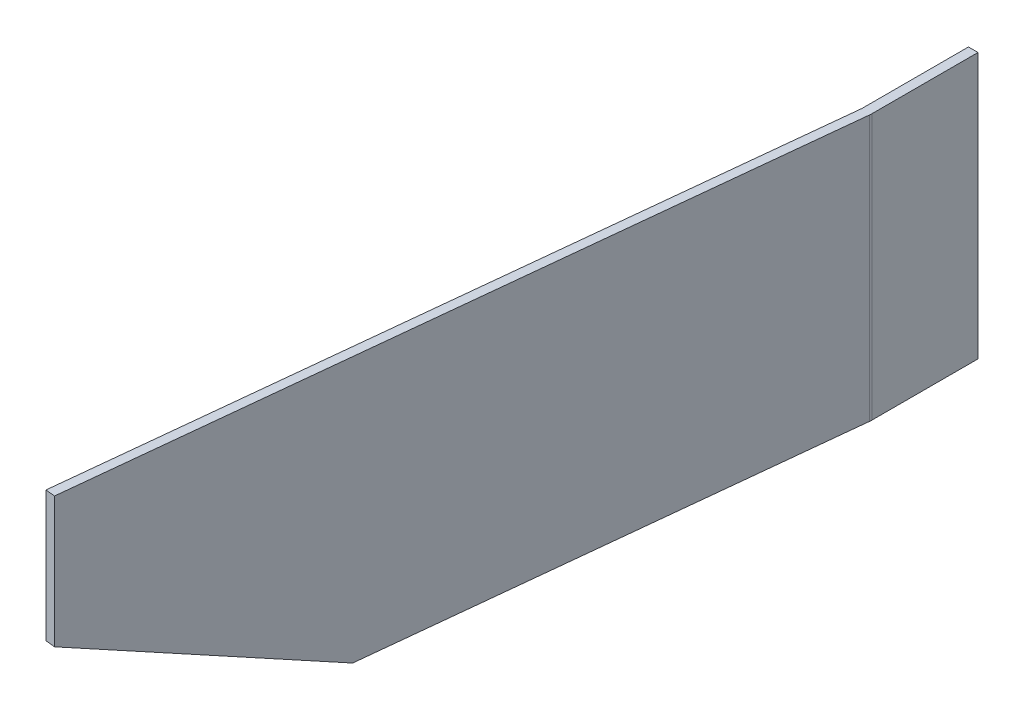
ISO-10303-21;
HEADER;
FILE_DESCRIPTION(('STEP AP214'),'2;1');
FILE_NAME('part.step','',(''),(''),'','','');
FILE_SCHEMA(('AUTOMOTIVE_DESIGN { 1 0 10303 214 1 1 1 1 }'));
ENDSEC;
DATA;
#1=APPLICATION_CONTEXT('core data for automotive mechanical design processes');
#2=APPLICATION_PROTOCOL_DEFINITION('international standard','automotive_design',2000,#1);
#3=PRODUCT_CONTEXT('',#1,'mechanical');
#4=PRODUCT('Part','Part','',(#3));
#5=PRODUCT_RELATED_PRODUCT_CATEGORY('part','',(#4));
#6=PRODUCT_DEFINITION_FORMATION('','',#4);
#7=PRODUCT_DEFINITION_CONTEXT('part definition',#1,'design');
#8=PRODUCT_DEFINITION('design','',#6,#7);
#9=PRODUCT_DEFINITION_SHAPE('','',#8);
#10=(LENGTH_UNIT() NAMED_UNIT(*) SI_UNIT(.MILLI.,.METRE.));
#11=(NAMED_UNIT(*) PLANE_ANGLE_UNIT() SI_UNIT($,.RADIAN.));
#12=(NAMED_UNIT(*) SI_UNIT($,.STERADIAN.) SOLID_ANGLE_UNIT());
#13=UNCERTAINTY_MEASURE_WITH_UNIT(LENGTH_MEASURE(1.E-05),#10,'distance_accuracy_value','');
#14=(GEOMETRIC_REPRESENTATION_CONTEXT(3) GLOBAL_UNCERTAINTY_ASSIGNED_CONTEXT((#13)) GLOBAL_UNIT_ASSIGNED_CONTEXT((#10,
#11,#12)) REPRESENTATION_CONTEXT('',''));
#15=CARTESIAN_POINT('',(0.,0.,0.));
#16=DIRECTION('',(0.,0.,1.));
#17=DIRECTION('',(1.,0.,0.));
#18=AXIS2_PLACEMENT_3D('',#15,#16,#17);
#19=CARTESIAN_POINT('',(-1.143,0.,0.));
#20=DIRECTION('',(-1.,0.,0.));
#21=DIRECTION('',(0.,0.,1.));
#22=AXIS2_PLACEMENT_3D('',#19,#20,#21);
#23=PLANE('',#22);
#24=DIRECTION('',(0.,0.,1.));
#25=VECTOR('',#24,1.);
#26=CARTESIAN_POINT('',(-1.143,-31.75,-32.4539806661532));
#27=LINE('',#26,#25);
#28=CARTESIAN_POINT('',(-1.143,-31.75,-101.6));
#29=VERTEX_POINT('',#28);
#30=CARTESIAN_POINT('',(-1.143,-31.75,-76.2));
#31=VERTEX_POINT('',#30);
#32=EDGE_CURVE('E98',#29,#31,#27,.T.);
#33=ORIENTED_EDGE('',*,*,#32,.T.);
#34=DIRECTION('',(0.,-1.,0.));
#35=VECTOR('',#34,1.);
#36=CARTESIAN_POINT('',(-1.143,-36.03433741048,-76.2));
#37=LINE('',#36,#35);
#38=CARTESIAN_POINT('',(-1.143,31.75,-76.2));
#39=VERTEX_POINT('',#38);
#40=EDGE_CURVE('E85',#31,#39,#37,.F.);
#41=ORIENTED_EDGE('',*,*,#40,.T.);
#42=DIRECTION('',(0.,0.,-1.));
#43=VECTOR('',#42,1.);
#44=CARTESIAN_POINT('',(-1.143,31.75,0.));
#45=LINE('',#44,#43);
#46=CARTESIAN_POINT('',(-1.143,31.75,-101.6));
#47=VERTEX_POINT('',#46);
#48=EDGE_CURVE('E102',#39,#47,#45,.T.);
#49=ORIENTED_EDGE('',*,*,#48,.T.);
#50=DIRECTION('',(0.,1.,0.));
#51=VECTOR('',#50,1.);
#52=CARTESIAN_POINT('',(-1.143,0.,-101.6));
#53=LINE('',#52,#51);
#54=EDGE_CURVE('E99',#47,#29,#53,.F.);
#55=ORIENTED_EDGE('',*,*,#54,.T.);
#56=EDGE_LOOP('',(#33,#41,#49,#55));
#57=FACE_BOUND('',#56,.T.);
#58=ADVANCED_FACE('F16',(#57),#23,.T.);
#59=CARTESIAN_POINT('',(0.,0.,-101.6));
#60=DIRECTION('',(0.,0.,1.));
#61=DIRECTION('',(1.,0.,0.));
#62=AXIS2_PLACEMENT_3D('',#59,#60,#61);
#63=PLANE('',#62);
#64=ORIENTED_EDGE('',*,*,#54,.F.);
#65=DIRECTION('',(1.,0.,0.));
#66=VECTOR('',#65,1.);
#67=CARTESIAN_POINT('',(0.,31.75,-101.6));
#68=LINE('',#67,#66);
#69=CARTESIAN_POINT('',(1.143,31.75,-101.6));
#70=VERTEX_POINT('',#69);
#71=EDGE_CURVE('E95',#47,#70,#68,.T.);
#72=ORIENTED_EDGE('',*,*,#71,.T.);
#73=DIRECTION('',(0.,1.,0.));
#74=VECTOR('',#73,1.);
#75=CARTESIAN_POINT('',(1.143,0.,-101.6));
#76=LINE('',#75,#74);
#77=CARTESIAN_POINT('',(1.143,-31.75,-101.6));
#78=VERTEX_POINT('',#77);
#79=EDGE_CURVE('E112',#70,#78,#76,.F.);
#80=ORIENTED_EDGE('',*,*,#79,.T.);
#81=DIRECTION('',(1.,0.,0.));
#82=VECTOR('',#81,1.);
#83=CARTESIAN_POINT('',(0.,-31.75,-101.6));
#84=LINE('',#83,#82);
#85=EDGE_CURVE('E103',#78,#29,#84,.F.);
#86=ORIENTED_EDGE('',*,*,#85,.T.);
#87=EDGE_LOOP('',(#64,#72,#80,#86));
#88=FACE_BOUND('',#87,.T.);
#89=ADVANCED_FACE('F272',(#88),#63,.F.);
#90=CARTESIAN_POINT('',(-3.429,-36.03433741048,-76.2));
#91=DIRECTION('',(0.,-1.,0.));
#92=DIRECTION('',(0.,0.,-1.));
#93=AXIS2_PLACEMENT_3D('',#90,#91,#92);
#94=CYLINDRICAL_SURFACE('',#93,2.286);
#95=ORIENTED_EDGE('',*,*,#40,.F.);
#96=CARTESIAN_POINT('',(-3.429,-31.75,-76.2));
#97=DIRECTION('',(0.,-1.,0.));
#98=DIRECTION('',(0.,0.,-1.));
#99=AXIS2_PLACEMENT_3D('',#96,#97,#98);
#100=CIRCLE('',#99,2.286);
#101=CARTESIAN_POINT('',(-1.15552294718611,-31.75,-75.9610479329711));
#102=VERTEX_POINT('',#101);
#103=EDGE_CURVE('E19',#31,#102,#100,.T.);
#104=ORIENTED_EDGE('',*,*,#103,.T.);
#105=DIRECTION('',(0.,1.,0.));
#106=VECTOR('',#105,1.);
#107=CARTESIAN_POINT('',(-1.15552294718375,0.,-75.9610479329719));
#108=LINE('',#107,#106);
#109=CARTESIAN_POINT('',(-1.15552294718611,31.75,-75.9610479329711));
#110=VERTEX_POINT('',#109);
#111=EDGE_CURVE('E110',#110,#102,#108,.F.);
#112=ORIENTED_EDGE('',*,*,#111,.F.);
#113=CARTESIAN_POINT('',(-3.429,31.75,-76.2));
#114=DIRECTION('',(0.,-1.,0.));
#115=DIRECTION('',(0.,0.,-1.));
#116=AXIS2_PLACEMENT_3D('',#113,#114,#115);
#117=CIRCLE('',#116,2.286);
#118=EDGE_CURVE('E91',#110,#39,#117,.F.);
#119=ORIENTED_EDGE('',*,*,#118,.T.);
#120=EDGE_LOOP('',(#95,#104,#112,#119));
#121=FACE_BOUND('',#120,.T.);
#122=ADVANCED_FACE('F87',(#121),#94,.F.);
#123=CARTESIAN_POINT('',(1.143,0.,0.));
#124=DIRECTION('',(-1.,0.,0.));
#125=DIRECTION('',(0.,0.,1.));
#126=AXIS2_PLACEMENT_3D('',#123,#124,#125);
#127=PLANE('',#126);
#128=ORIENTED_EDGE('',*,*,#79,.F.);
#129=DIRECTION('',(0.,0.,1.));
#130=VECTOR('',#129,1.);
#131=CARTESIAN_POINT('',(1.143,31.75,0.));
#132=LINE('',#131,#130);
#133=CARTESIAN_POINT('',(1.143,31.75,-76.2));
#134=VERTEX_POINT('',#133);
#135=EDGE_CURVE('E94',#134,#70,#132,.F.);
#136=ORIENTED_EDGE('',*,*,#135,.F.);
#137=DIRECTION('',(0.,-1.,0.));
#138=VECTOR('',#137,1.);
#139=CARTESIAN_POINT('',(1.143,-36.03433741048,-76.2));
#140=LINE('',#139,#138);
#141=CARTESIAN_POINT('',(1.143,-31.75,-76.2));
#142=VERTEX_POINT('',#141);
#143=EDGE_CURVE('E142',#142,#134,#140,.F.);
#144=ORIENTED_EDGE('',*,*,#143,.F.);
#145=DIRECTION('',(0.,0.,1.));
#146=VECTOR('',#145,1.);
#147=CARTESIAN_POINT('',(1.143,-31.75,0.));
#148=LINE('',#147,#146);
#149=EDGE_CURVE('E109',#78,#142,#148,.T.);
#150=ORIENTED_EDGE('',*,*,#149,.F.);
#151=EDGE_LOOP('',(#128,#136,#144,#150));
#152=FACE_BOUND('',#151,.T.);
#153=ADVANCED_FACE('F170',(#152),#127,.F.);
#154=CARTESIAN_POINT('',(-9.08760377733674,0.,-0.492340034575518));
#155=DIRECTION('',(-0.994521895368269,0.,-0.104528463267697));
#156=DIRECTION('',(-0.104528463267697,0.,0.994521895368269));
#157=AXIS2_PLACEMENT_3D('',#154,#155,#156);
#158=PLANE('',#157);
#159=DIRECTION('',(0.104528463267644,0.,-0.994521895368275));
#160=VECTOR('',#159,1.);
#161=CARTESIAN_POINT('',(-19.70769564533,31.75,100.551084534843));
#162=LINE('',#161,#160);
#163=CARTESIAN_POINT('',(-19.7076956453312,31.75,100.551084534842));
#164=VERTEX_POINT('',#163);
#165=EDGE_CURVE('E156',#164,#110,#162,.T.);
#166=ORIENTED_EDGE('',*,*,#165,.T.);
#167=ORIENTED_EDGE('',*,*,#111,.T.);
#168=DIRECTION('',(-0.10452846326765,0.,0.994521895368274));
#169=VECTOR('',#168,1.);
#170=CARTESIAN_POINT('',(-1.15552294718824,-31.75,-75.9610479329724));
#171=LINE('',#170,#169);
#172=CARTESIAN_POINT('',(-12.9229661934296,-31.7500000000005,35.9986958061476));
#173=VERTEX_POINT('',#172);
#174=EDGE_CURVE('E108',#102,#173,#171,.T.);
#175=ORIENTED_EDGE('',*,*,#174,.T.);
#176=DIRECTION('',(0.0936144907977763,-0.444883376374204,-0.890682383646697));
#177=VECTOR('',#176,1.);
#178=CARTESIAN_POINT('',(-19.7076956453299,0.493014095618827,100.551084534842));
#179=LINE('',#178,#177);
#180=CARTESIAN_POINT('',(-19.7076956453312,0.493014095618307,100.551084534842));
#181=VERTEX_POINT('',#180);
#182=EDGE_CURVE('E154',#181,#173,#179,.T.);
#183=ORIENTED_EDGE('',*,*,#182,.F.);
#184=DIRECTION('',(0.,1.,0.));
#185=VECTOR('',#184,1.);
#186=CARTESIAN_POINT('',(-19.7076956453299,16.1215070478079,100.551084534842));
#187=LINE('',#186,#185);
#188=EDGE_CURVE('E184',#181,#164,#187,.T.);
#189=ORIENTED_EDGE('',*,*,#188,.T.);
#190=EDGE_LOOP('',(#166,#167,#175,#183,#189));
#191=FACE_BOUND('',#190,.T.);
#192=ADVANCED_FACE('F194',(#191),#158,.T.);
#193=CARTESIAN_POINT('',(-3.429,-36.03433741048,-76.2));
#194=DIRECTION('',(0.,-1.,0.));
#195=DIRECTION('',(0.,0.,-1.));
#196=AXIS2_PLACEMENT_3D('',#193,#194,#195);
#197=CYLINDRICAL_SURFACE('',#196,4.572);
#198=CARTESIAN_POINT('',(-3.429,31.75,-76.2));
#199=DIRECTION('',(0.,-1.,0.));
#200=DIRECTION('',(0.,0.,-1.));
#201=AXIS2_PLACEMENT_3D('',#198,#199,#200);
#202=CIRCLE('',#201,4.572);
#203=CARTESIAN_POINT('',(1.11795410562549,31.75,-75.7220958659423));
#204=VERTEX_POINT('',#203);
#205=EDGE_CURVE('E140',#134,#204,#202,.T.);
#206=ORIENTED_EDGE('',*,*,#205,.T.);
#207=DIRECTION('',(0.,1.,0.));
#208=VECTOR('',#207,1.);
#209=CARTESIAN_POINT('',(1.11795410562725,0.,-75.7220958659444));
#210=LINE('',#209,#208);
#211=CARTESIAN_POINT('',(1.11795410562549,-31.75,-75.7220958659423));
#212=VERTEX_POINT('',#211);
#213=EDGE_CURVE('E158',#204,#212,#210,.F.);
#214=ORIENTED_EDGE('',*,*,#213,.T.);
#215=CARTESIAN_POINT('',(-3.429,-31.75,-76.2));
#216=DIRECTION('',(0.,-1.,0.));
#217=DIRECTION('',(0.,0.,-1.));
#218=AXIS2_PLACEMENT_3D('',#215,#216,#217);
#219=CIRCLE('',#218,4.572);
#220=EDGE_CURVE('E143',#212,#142,#219,.F.);
#221=ORIENTED_EDGE('',*,*,#220,.T.);
#222=ORIENTED_EDGE('',*,*,#143,.T.);
#223=EDGE_LOOP('',(#206,#214,#221,#222));
#224=FACE_BOUND('',#223,.T.);
#225=ADVANCED_FACE('F171',(#224),#197,.T.);
#226=CARTESIAN_POINT('',(-4.5585005249797,-31.75,-32.6490583654052));
#227=DIRECTION('',(0.,1.,0.));
#228=DIRECTION('',(0.,0.,1.));
#229=AXIS2_PLACEMENT_3D('',#226,#227,#228);
#230=PLANE('',#229);
#231=DIRECTION('',(0.994521895368351,-3.7031717247471E-13,0.104528463266911));
#232=VECTOR('',#231,1.);
#233=CARTESIAN_POINT('',(-12.9229661934293,-31.7500000000019,35.9986958061483));
#234=LINE('',#233,#232);
#235=CARTESIAN_POINT('',(-10.6494891406186,-31.7500000000007,36.2376478731753));
#236=VERTEX_POINT('',#235);
#237=EDGE_CURVE('E180',#173,#236,#234,.T.);
#238=ORIENTED_EDGE('',*,*,#237,.F.);
#239=ORIENTED_EDGE('',*,*,#174,.F.);
#240=ORIENTED_EDGE('',*,*,#103,.F.);
#241=ORIENTED_EDGE('',*,*,#32,.F.);
#242=ORIENTED_EDGE('',*,*,#85,.F.);
#243=ORIENTED_EDGE('',*,*,#149,.T.);
#244=ORIENTED_EDGE('',*,*,#220,.F.);
#245=DIRECTION('',(-0.104528463267697,0.,0.994521895368269));
#246=VECTOR('',#245,1.);
#247=CARTESIAN_POINT('',(-6.814126724526,-31.75,-0.253387967545556));
#248=LINE('',#247,#246);
#249=EDGE_CURVE('E159',#212,#236,#248,.T.);
#250=ORIENTED_EDGE('',*,*,#249,.T.);
#251=EDGE_LOOP('',(#238,#239,#240,#241,#242,#243,#244,#250));
#252=FACE_BOUND('',#251,.T.);
#253=ADVANCED_FACE('F106',(#252),#230,.F.);
#254=CARTESIAN_POINT('',(-15.1785923929755,-15.6284929521921,68.394366204009));
#255=DIRECTION('',(-0.0465029756657211,-0.89558851121812,0.44244625868951));
#256=DIRECTION('',(0.,-0.442925436940545,-0.896558451697951));
#257=AXIS2_PLACEMENT_3D('',#254,#255,#256);
#258=PLANE('',#257);
#259=ORIENTED_EDGE('',*,*,#237,.T.);
#260=DIRECTION('',(-0.0936144907978366,0.444883376374163,0.890682383646711));
#261=VECTOR('',#260,1.);
#262=CARTESIAN_POINT('',(-10.6494891406189,-31.75,36.237647873175));
#263=LINE('',#262,#261);
#264=CARTESIAN_POINT('',(-17.4342185925204,0.493014095617886,100.790036601871));
#265=VERTEX_POINT('',#264);
#266=EDGE_CURVE('E163',#236,#265,#263,.T.);
#267=ORIENTED_EDGE('',*,*,#266,.T.);
#268=DIRECTION('',(-0.994521895368269,0.,-0.104528463267697));
#269=VECTOR('',#268,1.);
#270=CARTESIAN_POINT('',(-18.5709571189259,0.493014095617791,100.670560568357));
#271=LINE('',#270,#269);
#272=EDGE_CURVE('E182',#265,#181,#271,.T.);
#273=ORIENTED_EDGE('',*,*,#272,.T.);
#274=ORIENTED_EDGE('',*,*,#182,.T.);
#275=EDGE_LOOP('',(#259,#267,#273,#274));
#276=FACE_BOUND('',#275,.T.);
#277=ADVANCED_FACE('F193',(#276),#258,.T.);
#278=CARTESIAN_POINT('',(-18.5709571189259,16.1215070478079,100.670560568357));
#279=DIRECTION('',(0.104528463267697,0.,-0.994521895368269));
#280=DIRECTION('',(-0.994521895368269,0.,-0.104528463267697));
#281=AXIS2_PLACEMENT_3D('',#278,#279,#280);
#282=PLANE('',#281);
#283=ORIENTED_EDGE('',*,*,#188,.F.);
#284=ORIENTED_EDGE('',*,*,#272,.F.);
#285=DIRECTION('',(0.,1.,0.));
#286=VECTOR('',#285,1.);
#287=CARTESIAN_POINT('',(-17.4342185925239,0.,100.79003660187));
#288=LINE('',#287,#286);
#289=CARTESIAN_POINT('',(-17.4342185925205,31.75,100.790036601871));
#290=VERTEX_POINT('',#289);
#291=EDGE_CURVE('E25',#265,#290,#288,.T.);
#292=ORIENTED_EDGE('',*,*,#291,.T.);
#293=DIRECTION('',(-0.99452189536837,0.,-0.104528463266731));
#294=VECTOR('',#293,1.);
#295=CARTESIAN_POINT('',(-17.4342185925192,31.75,100.790036601871));
#296=LINE('',#295,#294);
#297=EDGE_CURVE('E33',#290,#164,#296,.T.);
#298=ORIENTED_EDGE('',*,*,#297,.T.);
#299=EDGE_LOOP('',(#283,#284,#292,#298));
#300=FACE_BOUND('',#299,.T.);
#301=ADVANCED_FACE('F192',(#300),#282,.F.);
#302=CARTESIAN_POINT('',(-7.95086525093264,31.75,-0.372864001060448));
#303=DIRECTION('',(0.,-1.,0.));
#304=DIRECTION('',(0.,0.,-1.));
#305=AXIS2_PLACEMENT_3D('',#302,#303,#304);
#306=PLANE('',#305);
#307=ORIENTED_EDGE('',*,*,#297,.F.);
#308=DIRECTION('',(-0.104528463267697,0.,0.994521895368269));
#309=VECTOR('',#308,1.);
#310=CARTESIAN_POINT('',(-6.814126724526,31.75,-0.253387967545556));
#311=LINE('',#310,#309);
#312=EDGE_CURVE('E11',#290,#204,#311,.F.);
#313=ORIENTED_EDGE('',*,*,#312,.T.);
#314=ORIENTED_EDGE('',*,*,#205,.F.);
#315=ORIENTED_EDGE('',*,*,#135,.T.);
#316=ORIENTED_EDGE('',*,*,#71,.F.);
#317=ORIENTED_EDGE('',*,*,#48,.F.);
#318=ORIENTED_EDGE('',*,*,#118,.F.);
#319=ORIENTED_EDGE('',*,*,#165,.F.);
#320=EDGE_LOOP('',(#307,#313,#314,#315,#316,#317,#318,#319));
#321=FACE_BOUND('',#320,.T.);
#322=ADVANCED_FACE('F167',(#321),#306,.F.);
#323=CARTESIAN_POINT('',(-6.814126724526,0.,-0.253387967545556));
#324=DIRECTION('',(-0.994521895368269,0.,-0.104528463267697));
#325=DIRECTION('',(-0.104528463267697,0.,0.994521895368269));
#326=AXIS2_PLACEMENT_3D('',#323,#324,#325);
#327=PLANE('',#326);
#328=ORIENTED_EDGE('',*,*,#291,.F.);
#329=ORIENTED_EDGE('',*,*,#266,.F.);
#330=ORIENTED_EDGE('',*,*,#249,.F.);
#331=ORIENTED_EDGE('',*,*,#213,.F.);
#332=ORIENTED_EDGE('',*,*,#312,.F.);
#333=EDGE_LOOP('',(#328,#329,#330,#331,#332));
#334=FACE_BOUND('',#333,.T.);
#335=ADVANCED_FACE('F176',(#334),#327,.F.);
#336=CLOSED_SHELL('',(#58,#89,#122,#153,#192,#225,#253,#277,#301,#322,#335));
#337=MANIFOLD_SOLID_BREP('B1',#336);
#338=ADVANCED_BREP_SHAPE_REPRESENTATION('',(#18,#337),#14);
#339=SHAPE_DEFINITION_REPRESENTATION(#9,#338);
ENDSEC;
END-ISO-10303-21;
